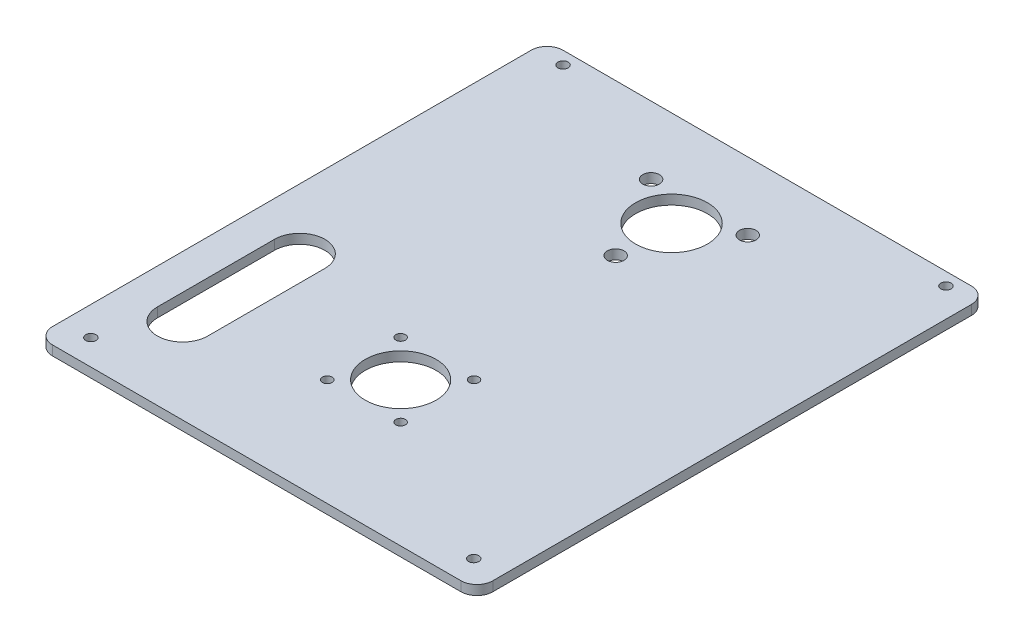
ISO-10303-21;
HEADER;
FILE_DESCRIPTION(('STEP AP214'),'2;1');
FILE_NAME('part.step','',(''),(''),'','','');
FILE_SCHEMA(('AUTOMOTIVE_DESIGN { 1 0 10303 214 1 1 1 1 }'));
ENDSEC;
DATA;
#1=APPLICATION_CONTEXT('core data for automotive mechanical design processes');
#2=APPLICATION_PROTOCOL_DEFINITION('international standard','automotive_design',2000,#1);
#3=PRODUCT_CONTEXT('',#1,'mechanical');
#4=PRODUCT('Part','Part','',(#3));
#5=PRODUCT_RELATED_PRODUCT_CATEGORY('part','',(#4));
#6=PRODUCT_DEFINITION_FORMATION('','',#4);
#7=PRODUCT_DEFINITION_CONTEXT('part definition',#1,'design');
#8=PRODUCT_DEFINITION('design','',#6,#7);
#9=PRODUCT_DEFINITION_SHAPE('','',#8);
#10=(LENGTH_UNIT() NAMED_UNIT(*) SI_UNIT(.MILLI.,.METRE.));
#11=(NAMED_UNIT(*) PLANE_ANGLE_UNIT() SI_UNIT($,.RADIAN.));
#12=(NAMED_UNIT(*) SI_UNIT($,.STERADIAN.) SOLID_ANGLE_UNIT());
#13=UNCERTAINTY_MEASURE_WITH_UNIT(LENGTH_MEASURE(1.E-05),#10,'distance_accuracy_value','');
#14=(GEOMETRIC_REPRESENTATION_CONTEXT(3) GLOBAL_UNCERTAINTY_ASSIGNED_CONTEXT((#13)) GLOBAL_UNIT_ASSIGNED_CONTEXT((#10,
#11,#12)) REPRESENTATION_CONTEXT('',''));
#15=CARTESIAN_POINT('',(0.,0.,0.));
#16=DIRECTION('',(0.,0.,1.));
#17=DIRECTION('',(1.,0.,0.));
#18=AXIS2_PLACEMENT_3D('',#15,#16,#17);
#19=CARTESIAN_POINT('',(64.,3.,75.));
#20=DIRECTION('',(0.,-1.,0.));
#21=DIRECTION('',(0.,0.,-1.));
#22=AXIS2_PLACEMENT_3D('',#19,#20,#21);
#23=PLANE('',#22);
#24=CARTESIAN_POINT('',(-15.15,3.,-58.75));
#25=DIRECTION('',(0.,1.,0.));
#26=DIRECTION('',(0.,0.,-1.));
#27=AXIS2_PLACEMENT_3D('',#24,#25,#26);
#28=CIRCLE('',#27,2.6);
#29=CARTESIAN_POINT('',(-15.15,3.,-61.35));
#30=VERTEX_POINT('',#29);
#31=EDGE_CURVE('E165',#30,#30,#28,.T.);
#32=ORIENTED_EDGE('',*,*,#31,.F.);
#33=EDGE_LOOP('',(#32));
#34=FACE_BOUND('',#33,.T.);
#35=CARTESIAN_POINT('',(15.15,3.,-58.75));
#36=DIRECTION('',(0.,1.,0.));
#37=DIRECTION('',(0.,0.,1.));
#38=AXIS2_PLACEMENT_3D('',#35,#36,#37);
#39=CIRCLE('',#38,2.6);
#40=CARTESIAN_POINT('',(15.15,3.,-56.15));
#41=VERTEX_POINT('',#40);
#42=EDGE_CURVE('E171',#41,#41,#39,.T.);
#43=ORIENTED_EDGE('',*,*,#42,.F.);
#44=EDGE_LOOP('',(#43));
#45=FACE_BOUND('',#44,.T.);
#46=CARTESIAN_POINT('',(0.,3.,-32.5));
#47=DIRECTION('',(0.,1.,0.));
#48=DIRECTION('',(0.,0.,1.));
#49=AXIS2_PLACEMENT_3D('',#46,#47,#48);
#50=CIRCLE('',#49,2.6);
#51=CARTESIAN_POINT('',(0.,3.,-29.9));
#52=VERTEX_POINT('',#51);
#53=EDGE_CURVE('E177',#52,#52,#50,.T.);
#54=ORIENTED_EDGE('',*,*,#53,.F.);
#55=EDGE_LOOP('',(#54));
#56=FACE_BOUND('',#55,.T.);
#57=CARTESIAN_POINT('',(-11.5,3.,23.4));
#58=DIRECTION('',(0.,1.,0.));
#59=DIRECTION('',(0.,0.,-1.));
#60=AXIS2_PLACEMENT_3D('',#57,#58,#59);
#61=CIRCLE('',#60,1.5);
#62=CARTESIAN_POINT('',(-11.5,3.,21.9));
#63=VERTEX_POINT('',#62);
#64=EDGE_CURVE('E183',#63,#63,#61,.T.);
#65=ORIENTED_EDGE('',*,*,#64,.F.);
#66=EDGE_LOOP('',(#65));
#67=FACE_BOUND('',#66,.T.);
#68=CARTESIAN_POINT('',(-11.5,3.,46.4));
#69=DIRECTION('',(0.,1.,0.));
#70=DIRECTION('',(0.,0.,-1.));
#71=AXIS2_PLACEMENT_3D('',#68,#69,#70);
#72=CIRCLE('',#71,1.5);
#73=CARTESIAN_POINT('',(-11.5,3.,44.9));
#74=VERTEX_POINT('',#73);
#75=EDGE_CURVE('E189',#74,#74,#72,.T.);
#76=ORIENTED_EDGE('',*,*,#75,.F.);
#77=EDGE_LOOP('',(#76));
#78=FACE_BOUND('',#77,.T.);
#79=CARTESIAN_POINT('',(11.5,3.,23.4));
#80=DIRECTION('',(0.,1.,0.));
#81=DIRECTION('',(0.,0.,1.));
#82=AXIS2_PLACEMENT_3D('',#79,#80,#81);
#83=CIRCLE('',#82,1.5);
#84=CARTESIAN_POINT('',(11.5,3.,24.9));
#85=VERTEX_POINT('',#84);
#86=EDGE_CURVE('E195',#85,#85,#83,.T.);
#87=ORIENTED_EDGE('',*,*,#86,.F.);
#88=EDGE_LOOP('',(#87));
#89=FACE_BOUND('',#88,.T.);
#90=CARTESIAN_POINT('',(11.5,3.,46.4));
#91=DIRECTION('',(0.,1.,0.));
#92=DIRECTION('',(0.,0.,1.));
#93=AXIS2_PLACEMENT_3D('',#90,#91,#92);
#94=CIRCLE('',#93,1.5);
#95=CARTESIAN_POINT('',(11.5,3.,47.9));
#96=VERTEX_POINT('',#95);
#97=EDGE_CURVE('E201',#96,#96,#94,.T.);
#98=ORIENTED_EDGE('',*,*,#97,.F.);
#99=EDGE_LOOP('',(#98));
#100=FACE_BOUND('',#99,.T.);
#101=CARTESIAN_POINT('',(0.,3.,-50.));
#102=DIRECTION('',(0.,1.,0.));
#103=DIRECTION('',(0.,0.,1.));
#104=AXIS2_PLACEMENT_3D('',#101,#102,#103);
#105=CIRCLE('',#104,11.25);
#106=CARTESIAN_POINT('',(0.,3.,-38.75));
#107=VERTEX_POINT('',#106);
#108=EDGE_CURVE('E207',#107,#107,#105,.T.);
#109=ORIENTED_EDGE('',*,*,#108,.F.);
#110=EDGE_LOOP('',(#109));
#111=FACE_BOUND('',#110,.T.);
#112=CARTESIAN_POINT('',(0.,3.,34.9));
#113=DIRECTION('',(0.,1.,0.));
#114=DIRECTION('',(0.,0.,1.));
#115=AXIS2_PLACEMENT_3D('',#112,#113,#114);
#116=CIRCLE('',#115,11.1);
#117=CARTESIAN_POINT('',(0.,3.,46.));
#118=VERTEX_POINT('',#117);
#119=EDGE_CURVE('E213',#118,#118,#116,.T.);
#120=ORIENTED_EDGE('',*,*,#119,.F.);
#121=EDGE_LOOP('',(#120));
#122=FACE_BOUND('',#121,.T.);
#123=CARTESIAN_POINT('',(-60.,3.,72.));
#124=DIRECTION('',(0.,1.,0.));
#125=DIRECTION('',(0.,0.,-1.));
#126=AXIS2_PLACEMENT_3D('',#123,#124,#125);
#127=CIRCLE('',#126,1.6);
#128=CARTESIAN_POINT('',(-60.,3.,70.4));
#129=VERTEX_POINT('',#128);
#130=EDGE_CURVE('E219',#129,#129,#127,.T.);
#131=ORIENTED_EDGE('',*,*,#130,.F.);
#132=EDGE_LOOP('',(#131));
#133=FACE_BOUND('',#132,.T.);
#134=CARTESIAN_POINT('',(60.,3.,72.));
#135=DIRECTION('',(0.,1.,0.));
#136=DIRECTION('',(0.,0.,1.));
#137=AXIS2_PLACEMENT_3D('',#134,#135,#136);
#138=CIRCLE('',#137,1.6);
#139=CARTESIAN_POINT('',(60.,3.,73.6));
#140=VERTEX_POINT('',#139);
#141=EDGE_CURVE('E225',#140,#140,#138,.T.);
#142=ORIENTED_EDGE('',*,*,#141,.F.);
#143=EDGE_LOOP('',(#142));
#144=FACE_BOUND('',#143,.T.);
#145=CARTESIAN_POINT('',(-60.,3.,-76.));
#146=DIRECTION('',(0.,1.,0.));
#147=DIRECTION('',(0.,0.,-1.));
#148=AXIS2_PLACEMENT_3D('',#145,#146,#147);
#149=CIRCLE('',#148,1.6);
#150=CARTESIAN_POINT('',(-60.,3.,-77.6));
#151=VERTEX_POINT('',#150);
#152=EDGE_CURVE('E231',#151,#151,#149,.T.);
#153=ORIENTED_EDGE('',*,*,#152,.F.);
#154=EDGE_LOOP('',(#153));
#155=FACE_BOUND('',#154,.T.);
#156=CARTESIAN_POINT('',(60.,3.,-76.));
#157=DIRECTION('',(0.,1.,0.));
#158=DIRECTION('',(0.,0.,1.));
#159=AXIS2_PLACEMENT_3D('',#156,#157,#158);
#160=CIRCLE('',#159,1.6);
#161=CARTESIAN_POINT('',(60.,3.,-74.4));
#162=VERTEX_POINT('',#161);
#163=EDGE_CURVE('E237',#162,#162,#160,.T.);
#164=ORIENTED_EDGE('',*,*,#163,.F.);
#165=EDGE_LOOP('',(#164));
#166=FACE_BOUND('',#165,.T.);
#167=CARTESIAN_POINT('',(64.,3.,75.));
#168=DIRECTION('',(0.,1.,0.));
#169=DIRECTION('',(0.,0.,-1.));
#170=AXIS2_PLACEMENT_3D('',#167,#168,#169);
#171=CIRCLE('',#170,5.);
#172=CARTESIAN_POINT('',(64.,3.,80.));
#173=VERTEX_POINT('',#172);
#174=CARTESIAN_POINT('',(69.,3.,75.));
#175=VERTEX_POINT('',#174);
#176=EDGE_CURVE('E243',#173,#175,#171,.T.);
#177=ORIENTED_EDGE('',*,*,#176,.T.);
#178=DIRECTION('',(0.,0.,-1.));
#179=VECTOR('',#178,1.);
#180=CARTESIAN_POINT('',(69.,3.,75.));
#181=LINE('',#180,#179);
#182=CARTESIAN_POINT('',(69.,3.,-75.));
#183=VERTEX_POINT('',#182);
#184=EDGE_CURVE('E246',#175,#183,#181,.T.);
#185=ORIENTED_EDGE('',*,*,#184,.T.);
#186=CARTESIAN_POINT('',(64.,3.,-75.));
#187=DIRECTION('',(0.,1.,0.));
#188=DIRECTION('',(0.,0.,1.));
#189=AXIS2_PLACEMENT_3D('',#186,#187,#188);
#190=CIRCLE('',#189,5.);
#191=CARTESIAN_POINT('',(64.,3.,-80.));
#192=VERTEX_POINT('',#191);
#193=EDGE_CURVE('E249',#183,#192,#190,.T.);
#194=ORIENTED_EDGE('',*,*,#193,.T.);
#195=DIRECTION('',(-1.,0.,0.));
#196=VECTOR('',#195,1.);
#197=CARTESIAN_POINT('',(64.,3.,-80.));
#198=LINE('',#197,#196);
#199=CARTESIAN_POINT('',(-64.,3.,-80.));
#200=VERTEX_POINT('',#199);
#201=EDGE_CURVE('E251',#192,#200,#198,.T.);
#202=ORIENTED_EDGE('',*,*,#201,.T.);
#203=CARTESIAN_POINT('',(-64.,3.,-75.));
#204=DIRECTION('',(0.,1.,0.));
#205=DIRECTION('',(0.,0.,-1.));
#206=AXIS2_PLACEMENT_3D('',#203,#204,#205);
#207=CIRCLE('',#206,5.);
#208=CARTESIAN_POINT('',(-69.,3.,-75.));
#209=VERTEX_POINT('',#208);
#210=EDGE_CURVE('E253',#200,#209,#207,.T.);
#211=ORIENTED_EDGE('',*,*,#210,.T.);
#212=DIRECTION('',(0.,0.,1.));
#213=VECTOR('',#212,1.);
#214=CARTESIAN_POINT('',(-69.,3.,75.));
#215=LINE('',#214,#213);
#216=CARTESIAN_POINT('',(-69.,3.,75.));
#217=VERTEX_POINT('',#216);
#218=EDGE_CURVE('E255',#209,#217,#215,.T.);
#219=ORIENTED_EDGE('',*,*,#218,.T.);
#220=CARTESIAN_POINT('',(-64.,3.,75.));
#221=DIRECTION('',(0.,1.,0.));
#222=DIRECTION('',(0.,0.,-1.));
#223=AXIS2_PLACEMENT_3D('',#220,#221,#222);
#224=CIRCLE('',#223,5.);
#225=CARTESIAN_POINT('',(-64.,3.,80.));
#226=VERTEX_POINT('',#225);
#227=EDGE_CURVE('E257',#217,#226,#224,.T.);
#228=ORIENTED_EDGE('',*,*,#227,.T.);
#229=DIRECTION('',(1.,0.,0.));
#230=VECTOR('',#229,1.);
#231=CARTESIAN_POINT('',(64.,3.,80.));
#232=LINE('',#231,#230);
#233=EDGE_CURVE('E259',#226,#173,#232,.T.);
#234=ORIENTED_EDGE('',*,*,#233,.T.);
#235=EDGE_LOOP('',(#177,#185,#194,#202,#211,#219,#228,#234));
#236=FACE_BOUND('',#235,.T.);
#237=CARTESIAN_POINT('',(-50.,3.,16.55));
#238=DIRECTION('',(0.,1.,0.));
#239=DIRECTION('',(0.,0.,1.));
#240=AXIS2_PLACEMENT_3D('',#237,#238,#239);
#241=CIRCLE('',#240,7.89999999999998);
#242=CARTESIAN_POINT('',(-42.1,3.,16.55));
#243=VERTEX_POINT('',#242);
#244=CARTESIAN_POINT('',(-57.9,3.,16.55));
#245=VERTEX_POINT('',#244);
#246=EDGE_CURVE('E129',#243,#245,#241,.T.);
#247=ORIENTED_EDGE('',*,*,#246,.F.);
#248=DIRECTION('',(0.,0.,-1.));
#249=VECTOR('',#248,1.);
#250=CARTESIAN_POINT('',(-42.1,3.,16.55));
#251=LINE('',#250,#249);
#252=CARTESIAN_POINT('',(-42.1,3.,53.25));
#253=VERTEX_POINT('',#252);
#254=EDGE_CURVE('E151',#253,#243,#251,.T.);
#255=ORIENTED_EDGE('',*,*,#254,.F.);
#256=CARTESIAN_POINT('',(-50.,3.,53.25));
#257=DIRECTION('',(0.,1.,0.));
#258=DIRECTION('',(0.,0.,1.));
#259=AXIS2_PLACEMENT_3D('',#256,#257,#258);
#260=CIRCLE('',#259,7.89999999999998);
#261=CARTESIAN_POINT('',(-57.9,3.,53.25));
#262=VERTEX_POINT('',#261);
#263=EDGE_CURVE('E149',#262,#253,#260,.T.);
#264=ORIENTED_EDGE('',*,*,#263,.F.);
#265=DIRECTION('',(0.,0.,1.));
#266=VECTOR('',#265,1.);
#267=CARTESIAN_POINT('',(-57.9,3.,16.55));
#268=LINE('',#267,#266);
#269=EDGE_CURVE('E137',#245,#262,#268,.T.);
#270=ORIENTED_EDGE('',*,*,#269,.F.);
#271=EDGE_LOOP('',(#247,#255,#264,#270));
#272=FACE_BOUND('',#271,.T.);
#273=ADVANCED_FACE('F40',(#34,#45,#56,#67,#78,#89,#100,#111,#122,#133,#144,#155,#166,#236,#272),
#23,.F.);
#274=CARTESIAN_POINT('',(64.,0.,75.));
#275=DIRECTION('',(0.,-1.,0.));
#276=DIRECTION('',(0.,0.,-1.));
#277=AXIS2_PLACEMENT_3D('',#274,#275,#276);
#278=PLANE('',#277);
#279=CARTESIAN_POINT('',(15.15,0.,-58.75));
#280=DIRECTION('',(0.,1.,0.));
#281=DIRECTION('',(0.,0.,1.));
#282=AXIS2_PLACEMENT_3D('',#279,#280,#281);
#283=CIRCLE('',#282,2.6);
#284=CARTESIAN_POINT('',(15.15,0.,-56.15));
#285=VERTEX_POINT('',#284);
#286=EDGE_CURVE('E168',#285,#285,#283,.T.);
#287=ORIENTED_EDGE('',*,*,#286,.T.);
#288=EDGE_LOOP('',(#287));
#289=FACE_BOUND('',#288,.T.);
#290=CARTESIAN_POINT('',(-11.5,0.,23.4));
#291=DIRECTION('',(0.,1.,0.));
#292=DIRECTION('',(0.,0.,-1.));
#293=AXIS2_PLACEMENT_3D('',#290,#291,#292);
#294=CIRCLE('',#293,1.5);
#295=CARTESIAN_POINT('',(-11.5,0.,21.9));
#296=VERTEX_POINT('',#295);
#297=EDGE_CURVE('E180',#296,#296,#294,.T.);
#298=ORIENTED_EDGE('',*,*,#297,.T.);
#299=EDGE_LOOP('',(#298));
#300=FACE_BOUND('',#299,.T.);
#301=CARTESIAN_POINT('',(11.5,0.,23.4));
#302=DIRECTION('',(0.,1.,0.));
#303=DIRECTION('',(0.,0.,1.));
#304=AXIS2_PLACEMENT_3D('',#301,#302,#303);
#305=CIRCLE('',#304,1.5);
#306=CARTESIAN_POINT('',(11.5,0.,24.9));
#307=VERTEX_POINT('',#306);
#308=EDGE_CURVE('E192',#307,#307,#305,.T.);
#309=ORIENTED_EDGE('',*,*,#308,.T.);
#310=EDGE_LOOP('',(#309));
#311=FACE_BOUND('',#310,.T.);
#312=CARTESIAN_POINT('',(0.,0.,-50.));
#313=DIRECTION('',(0.,1.,0.));
#314=DIRECTION('',(0.,0.,1.));
#315=AXIS2_PLACEMENT_3D('',#312,#313,#314);
#316=CIRCLE('',#315,11.25);
#317=CARTESIAN_POINT('',(0.,0.,-38.75));
#318=VERTEX_POINT('',#317);
#319=EDGE_CURVE('E204',#318,#318,#316,.T.);
#320=ORIENTED_EDGE('',*,*,#319,.T.);
#321=EDGE_LOOP('',(#320));
#322=FACE_BOUND('',#321,.T.);
#323=CARTESIAN_POINT('',(-60.,0.,72.));
#324=DIRECTION('',(0.,1.,0.));
#325=DIRECTION('',(0.,0.,-1.));
#326=AXIS2_PLACEMENT_3D('',#323,#324,#325);
#327=CIRCLE('',#326,1.6);
#328=CARTESIAN_POINT('',(-60.,0.,70.4));
#329=VERTEX_POINT('',#328);
#330=EDGE_CURVE('E216',#329,#329,#327,.T.);
#331=ORIENTED_EDGE('',*,*,#330,.T.);
#332=EDGE_LOOP('',(#331));
#333=FACE_BOUND('',#332,.T.);
#334=CARTESIAN_POINT('',(-60.,0.,-76.));
#335=DIRECTION('',(0.,1.,0.));
#336=DIRECTION('',(0.,0.,-1.));
#337=AXIS2_PLACEMENT_3D('',#334,#335,#336);
#338=CIRCLE('',#337,1.6);
#339=CARTESIAN_POINT('',(-60.,0.,-77.6));
#340=VERTEX_POINT('',#339);
#341=EDGE_CURVE('E228',#340,#340,#338,.T.);
#342=ORIENTED_EDGE('',*,*,#341,.T.);
#343=EDGE_LOOP('',(#342));
#344=FACE_BOUND('',#343,.T.);
#345=CARTESIAN_POINT('',(64.,0.,75.));
#346=DIRECTION('',(0.,1.,0.));
#347=DIRECTION('',(0.,0.,-1.));
#348=AXIS2_PLACEMENT_3D('',#345,#346,#347);
#349=CIRCLE('',#348,5.);
#350=CARTESIAN_POINT('',(64.,0.,80.));
#351=VERTEX_POINT('',#350);
#352=CARTESIAN_POINT('',(69.,0.,75.));
#353=VERTEX_POINT('',#352);
#354=EDGE_CURVE('E240',#351,#353,#349,.T.);
#355=ORIENTED_EDGE('',*,*,#354,.F.);
#356=DIRECTION('',(1.,0.,0.));
#357=VECTOR('',#356,1.);
#358=CARTESIAN_POINT('',(64.,0.,80.));
#359=LINE('',#358,#357);
#360=CARTESIAN_POINT('',(-64.,0.,80.));
#361=VERTEX_POINT('',#360);
#362=EDGE_CURVE('E247',#361,#351,#359,.T.);
#363=ORIENTED_EDGE('',*,*,#362,.F.);
#364=CARTESIAN_POINT('',(-64.,0.,75.));
#365=DIRECTION('',(0.,1.,0.));
#366=DIRECTION('',(0.,0.,-1.));
#367=AXIS2_PLACEMENT_3D('',#364,#365,#366);
#368=CIRCLE('',#367,5.);
#369=CARTESIAN_POINT('',(-69.,0.,75.));
#370=VERTEX_POINT('',#369);
#371=EDGE_CURVE('E274',#370,#361,#368,.T.);
#372=ORIENTED_EDGE('',*,*,#371,.F.);
#373=DIRECTION('',(0.,0.,1.));
#374=VECTOR('',#373,1.);
#375=CARTESIAN_POINT('',(-69.,0.,75.));
#376=LINE('',#375,#374);
#377=CARTESIAN_POINT('',(-69.,0.,-75.));
#378=VERTEX_POINT('',#377);
#379=EDGE_CURVE('E272',#378,#370,#376,.T.);
#380=ORIENTED_EDGE('',*,*,#379,.F.);
#381=CARTESIAN_POINT('',(-64.,0.,-75.));
#382=DIRECTION('',(0.,1.,0.));
#383=DIRECTION('',(0.,0.,-1.));
#384=AXIS2_PLACEMENT_3D('',#381,#382,#383);
#385=CIRCLE('',#384,5.);
#386=CARTESIAN_POINT('',(-64.,0.,-80.));
#387=VERTEX_POINT('',#386);
#388=EDGE_CURVE('E270',#387,#378,#385,.T.);
#389=ORIENTED_EDGE('',*,*,#388,.F.);
#390=DIRECTION('',(-1.,0.,0.));
#391=VECTOR('',#390,1.);
#392=CARTESIAN_POINT('',(64.,0.,-80.));
#393=LINE('',#392,#391);
#394=CARTESIAN_POINT('',(64.,0.,-80.));
#395=VERTEX_POINT('',#394);
#396=EDGE_CURVE('E268',#395,#387,#393,.T.);
#397=ORIENTED_EDGE('',*,*,#396,.F.);
#398=CARTESIAN_POINT('',(64.,0.,-75.));
#399=DIRECTION('',(0.,1.,0.));
#400=DIRECTION('',(0.,0.,1.));
#401=AXIS2_PLACEMENT_3D('',#398,#399,#400);
#402=CIRCLE('',#401,5.);
#403=CARTESIAN_POINT('',(69.,0.,-75.));
#404=VERTEX_POINT('',#403);
#405=EDGE_CURVE('E266',#404,#395,#402,.T.);
#406=ORIENTED_EDGE('',*,*,#405,.F.);
#407=DIRECTION('',(0.,0.,-1.));
#408=VECTOR('',#407,1.);
#409=CARTESIAN_POINT('',(69.,0.,75.));
#410=LINE('',#409,#408);
#411=EDGE_CURVE('E264',#353,#404,#410,.T.);
#412=ORIENTED_EDGE('',*,*,#411,.F.);
#413=EDGE_LOOP('',(#355,#363,#372,#380,#389,#397,#406,#412));
#414=FACE_BOUND('',#413,.T.);
#415=CARTESIAN_POINT('',(60.,0.,-76.));
#416=DIRECTION('',(0.,1.,0.));
#417=DIRECTION('',(0.,0.,1.));
#418=AXIS2_PLACEMENT_3D('',#415,#416,#417);
#419=CIRCLE('',#418,1.6);
#420=CARTESIAN_POINT('',(60.,0.,-74.4));
#421=VERTEX_POINT('',#420);
#422=EDGE_CURVE('E234',#421,#421,#419,.T.);
#423=ORIENTED_EDGE('',*,*,#422,.T.);
#424=EDGE_LOOP('',(#423));
#425=FACE_BOUND('',#424,.T.);
#426=CARTESIAN_POINT('',(60.,0.,72.));
#427=DIRECTION('',(0.,1.,0.));
#428=DIRECTION('',(0.,0.,1.));
#429=AXIS2_PLACEMENT_3D('',#426,#427,#428);
#430=CIRCLE('',#429,1.6);
#431=CARTESIAN_POINT('',(60.,0.,73.6));
#432=VERTEX_POINT('',#431);
#433=EDGE_CURVE('E222',#432,#432,#430,.T.);
#434=ORIENTED_EDGE('',*,*,#433,.T.);
#435=EDGE_LOOP('',(#434));
#436=FACE_BOUND('',#435,.T.);
#437=CARTESIAN_POINT('',(0.,0.,34.9));
#438=DIRECTION('',(0.,1.,0.));
#439=DIRECTION('',(0.,0.,1.));
#440=AXIS2_PLACEMENT_3D('',#437,#438,#439);
#441=CIRCLE('',#440,11.1);
#442=CARTESIAN_POINT('',(0.,0.,46.));
#443=VERTEX_POINT('',#442);
#444=EDGE_CURVE('E210',#443,#443,#441,.T.);
#445=ORIENTED_EDGE('',*,*,#444,.T.);
#446=EDGE_LOOP('',(#445));
#447=FACE_BOUND('',#446,.T.);
#448=CARTESIAN_POINT('',(11.5,0.,46.4));
#449=DIRECTION('',(0.,1.,0.));
#450=DIRECTION('',(0.,0.,1.));
#451=AXIS2_PLACEMENT_3D('',#448,#449,#450);
#452=CIRCLE('',#451,1.5);
#453=CARTESIAN_POINT('',(11.5,0.,47.9));
#454=VERTEX_POINT('',#453);
#455=EDGE_CURVE('E198',#454,#454,#452,.T.);
#456=ORIENTED_EDGE('',*,*,#455,.T.);
#457=EDGE_LOOP('',(#456));
#458=FACE_BOUND('',#457,.T.);
#459=CARTESIAN_POINT('',(-11.5,0.,46.4));
#460=DIRECTION('',(0.,1.,0.));
#461=DIRECTION('',(0.,0.,-1.));
#462=AXIS2_PLACEMENT_3D('',#459,#460,#461);
#463=CIRCLE('',#462,1.5);
#464=CARTESIAN_POINT('',(-11.5,0.,44.9));
#465=VERTEX_POINT('',#464);
#466=EDGE_CURVE('E186',#465,#465,#463,.T.);
#467=ORIENTED_EDGE('',*,*,#466,.T.);
#468=EDGE_LOOP('',(#467));
#469=FACE_BOUND('',#468,.T.);
#470=CARTESIAN_POINT('',(0.,0.,-32.5));
#471=DIRECTION('',(0.,1.,0.));
#472=DIRECTION('',(0.,0.,1.));
#473=AXIS2_PLACEMENT_3D('',#470,#471,#472);
#474=CIRCLE('',#473,2.6);
#475=CARTESIAN_POINT('',(0.,0.,-29.9));
#476=VERTEX_POINT('',#475);
#477=EDGE_CURVE('E174',#476,#476,#474,.T.);
#478=ORIENTED_EDGE('',*,*,#477,.T.);
#479=EDGE_LOOP('',(#478));
#480=FACE_BOUND('',#479,.T.);
#481=CARTESIAN_POINT('',(-15.15,0.,-58.75));
#482=DIRECTION('',(0.,1.,0.));
#483=DIRECTION('',(0.,0.,-1.));
#484=AXIS2_PLACEMENT_3D('',#481,#482,#483);
#485=CIRCLE('',#484,2.6);
#486=CARTESIAN_POINT('',(-15.15,0.,-61.35));
#487=VERTEX_POINT('',#486);
#488=EDGE_CURVE('E145',#487,#487,#485,.T.);
#489=ORIENTED_EDGE('',*,*,#488,.T.);
#490=EDGE_LOOP('',(#489));
#491=FACE_BOUND('',#490,.T.);
#492=DIRECTION('',(0.,0.,-1.));
#493=VECTOR('',#492,1.);
#494=CARTESIAN_POINT('',(-42.1,0.,16.55));
#495=LINE('',#494,#493);
#496=CARTESIAN_POINT('',(-42.1,0.,53.25));
#497=VERTEX_POINT('',#496);
#498=CARTESIAN_POINT('',(-42.1,0.,16.55));
#499=VERTEX_POINT('',#498);
#500=EDGE_CURVE('E138',#497,#499,#495,.T.);
#501=ORIENTED_EDGE('',*,*,#500,.T.);
#502=CARTESIAN_POINT('',(-50.,0.,16.55));
#503=DIRECTION('',(0.,1.,0.));
#504=DIRECTION('',(0.,0.,1.));
#505=AXIS2_PLACEMENT_3D('',#502,#503,#504);
#506=CIRCLE('',#505,7.89999999999998);
#507=CARTESIAN_POINT('',(-57.9,0.,16.55));
#508=VERTEX_POINT('',#507);
#509=EDGE_CURVE('E63',#499,#508,#506,.T.);
#510=ORIENTED_EDGE('',*,*,#509,.T.);
#511=DIRECTION('',(0.,0.,1.));
#512=VECTOR('',#511,1.);
#513=CARTESIAN_POINT('',(-57.9,0.,16.55));
#514=LINE('',#513,#512);
#515=CARTESIAN_POINT('',(-57.9,0.,53.25));
#516=VERTEX_POINT('',#515);
#517=EDGE_CURVE('E144',#508,#516,#514,.T.);
#518=ORIENTED_EDGE('',*,*,#517,.T.);
#519=CARTESIAN_POINT('',(-50.,0.,53.25));
#520=DIRECTION('',(0.,1.,0.));
#521=DIRECTION('',(0.,0.,1.));
#522=AXIS2_PLACEMENT_3D('',#519,#520,#521);
#523=CIRCLE('',#522,7.89999999999998);
#524=EDGE_CURVE('E157',#516,#497,#523,.T.);
#525=ORIENTED_EDGE('',*,*,#524,.T.);
#526=EDGE_LOOP('',(#501,#510,#518,#525));
#527=FACE_BOUND('',#526,.T.);
#528=ADVANCED_FACE('F304',(#289,#300,#311,#322,#333,#344,#414,#425,#436,#447,#458,#469,#480,
#491,#527),#278,.T.);
#529=CARTESIAN_POINT('',(64.,3.,75.));
#530=DIRECTION('',(0.,-1.,0.));
#531=DIRECTION('',(0.,0.,-1.));
#532=AXIS2_PLACEMENT_3D('',#529,#530,#531);
#533=CYLINDRICAL_SURFACE('',#532,5.);
#534=ORIENTED_EDGE('',*,*,#354,.T.);
#535=DIRECTION('',(0.,-1.,0.));
#536=VECTOR('',#535,1.);
#537=CARTESIAN_POINT('',(69.,3.,75.));
#538=LINE('',#537,#536);
#539=EDGE_CURVE('E11',#175,#353,#538,.T.);
#540=ORIENTED_EDGE('',*,*,#539,.F.);
#541=ORIENTED_EDGE('',*,*,#176,.F.);
#542=DIRECTION('',(0.,-1.,0.));
#543=VECTOR('',#542,1.);
#544=CARTESIAN_POINT('',(64.,3.,80.));
#545=LINE('',#544,#543);
#546=EDGE_CURVE('E261',#173,#351,#545,.T.);
#547=ORIENTED_EDGE('',*,*,#546,.T.);
#548=EDGE_LOOP('',(#534,#540,#541,#547));
#549=FACE_BOUND('',#548,.T.);
#550=ADVANCED_FACE('F42',(#549),#533,.T.);
#551=CARTESIAN_POINT('',(69.,3.,75.));
#552=DIRECTION('',(-1.,0.,0.));
#553=DIRECTION('',(0.,0.,1.));
#554=AXIS2_PLACEMENT_3D('',#551,#552,#553);
#555=PLANE('',#554);
#556=ORIENTED_EDGE('',*,*,#411,.T.);
#557=DIRECTION('',(0.,-1.,0.));
#558=VECTOR('',#557,1.);
#559=CARTESIAN_POINT('',(69.,3.,-75.));
#560=LINE('',#559,#558);
#561=EDGE_CURVE('E48',#183,#404,#560,.T.);
#562=ORIENTED_EDGE('',*,*,#561,.F.);
#563=ORIENTED_EDGE('',*,*,#184,.F.);
#564=ORIENTED_EDGE('',*,*,#539,.T.);
#565=EDGE_LOOP('',(#556,#562,#563,#564));
#566=FACE_BOUND('',#565,.T.);
#567=ADVANCED_FACE('F321',(#566),#555,.F.);
#568=CARTESIAN_POINT('',(64.,3.,-75.));
#569=DIRECTION('',(0.,-1.,0.));
#570=DIRECTION('',(0.,0.,-1.));
#571=AXIS2_PLACEMENT_3D('',#568,#569,#570);
#572=CYLINDRICAL_SURFACE('',#571,5.);
#573=ORIENTED_EDGE('',*,*,#405,.T.);
#574=DIRECTION('',(0.,-1.,0.));
#575=VECTOR('',#574,1.);
#576=CARTESIAN_POINT('',(64.,3.,-80.));
#577=LINE('',#576,#575);
#578=EDGE_CURVE('E291',#192,#395,#577,.T.);
#579=ORIENTED_EDGE('',*,*,#578,.F.);
#580=ORIENTED_EDGE('',*,*,#193,.F.);
#581=ORIENTED_EDGE('',*,*,#561,.T.);
#582=EDGE_LOOP('',(#573,#579,#580,#581));
#583=FACE_BOUND('',#582,.T.);
#584=ADVANCED_FACE('F298',(#583),#572,.T.);
#585=CARTESIAN_POINT('',(64.,3.,-80.));
#586=DIRECTION('',(0.,0.,1.));
#587=DIRECTION('',(1.,0.,0.));
#588=AXIS2_PLACEMENT_3D('',#585,#586,#587);
#589=PLANE('',#588);
#590=ORIENTED_EDGE('',*,*,#396,.T.);
#591=DIRECTION('',(0.,-1.,0.));
#592=VECTOR('',#591,1.);
#593=CARTESIAN_POINT('',(-64.,3.,-80.));
#594=LINE('',#593,#592);
#595=EDGE_CURVE('E288',#200,#387,#594,.T.);
#596=ORIENTED_EDGE('',*,*,#595,.F.);
#597=ORIENTED_EDGE('',*,*,#201,.F.);
#598=ORIENTED_EDGE('',*,*,#578,.T.);
#599=EDGE_LOOP('',(#590,#596,#597,#598));
#600=FACE_BOUND('',#599,.T.);
#601=ADVANCED_FACE('F310',(#600),#589,.F.);
#602=CARTESIAN_POINT('',(-64.,3.,-75.));
#603=DIRECTION('',(0.,-1.,0.));
#604=DIRECTION('',(0.,0.,-1.));
#605=AXIS2_PLACEMENT_3D('',#602,#603,#604);
#606=CYLINDRICAL_SURFACE('',#605,5.);
#607=ORIENTED_EDGE('',*,*,#388,.T.);
#608=DIRECTION('',(0.,-1.,0.));
#609=VECTOR('',#608,1.);
#610=CARTESIAN_POINT('',(-69.,3.,-75.));
#611=LINE('',#610,#609);
#612=EDGE_CURVE('E285',#209,#378,#611,.T.);
#613=ORIENTED_EDGE('',*,*,#612,.F.);
#614=ORIENTED_EDGE('',*,*,#210,.F.);
#615=ORIENTED_EDGE('',*,*,#595,.T.);
#616=EDGE_LOOP('',(#607,#613,#614,#615));
#617=FACE_BOUND('',#616,.T.);
#618=ADVANCED_FACE('F314',(#617),#606,.T.);
#619=CARTESIAN_POINT('',(-69.,3.,75.));
#620=DIRECTION('',(1.,0.,0.));
#621=DIRECTION('',(0.,0.,-1.));
#622=AXIS2_PLACEMENT_3D('',#619,#620,#621);
#623=PLANE('',#622);
#624=ORIENTED_EDGE('',*,*,#379,.T.);
#625=DIRECTION('',(0.,-1.,0.));
#626=VECTOR('',#625,1.);
#627=CARTESIAN_POINT('',(-69.,3.,75.));
#628=LINE('',#627,#626);
#629=EDGE_CURVE('E282',#217,#370,#628,.T.);
#630=ORIENTED_EDGE('',*,*,#629,.F.);
#631=ORIENTED_EDGE('',*,*,#218,.F.);
#632=ORIENTED_EDGE('',*,*,#612,.T.);
#633=EDGE_LOOP('',(#624,#630,#631,#632));
#634=FACE_BOUND('',#633,.T.);
#635=ADVANCED_FACE('F334',(#634),#623,.F.);
#636=CARTESIAN_POINT('',(-64.,3.,75.));
#637=DIRECTION('',(0.,-1.,0.));
#638=DIRECTION('',(0.,0.,-1.));
#639=AXIS2_PLACEMENT_3D('',#636,#637,#638);
#640=CYLINDRICAL_SURFACE('',#639,5.);
#641=ORIENTED_EDGE('',*,*,#371,.T.);
#642=DIRECTION('',(0.,-1.,0.));
#643=VECTOR('',#642,1.);
#644=CARTESIAN_POINT('',(-64.,3.,80.));
#645=LINE('',#644,#643);
#646=EDGE_CURVE('E279',#226,#361,#645,.T.);
#647=ORIENTED_EDGE('',*,*,#646,.F.);
#648=ORIENTED_EDGE('',*,*,#227,.F.);
#649=ORIENTED_EDGE('',*,*,#629,.T.);
#650=EDGE_LOOP('',(#641,#647,#648,#649));
#651=FACE_BOUND('',#650,.T.);
#652=ADVANCED_FACE('F332',(#651),#640,.T.);
#653=CARTESIAN_POINT('',(64.,3.,80.));
#654=DIRECTION('',(0.,0.,-1.));
#655=DIRECTION('',(-1.,0.,0.));
#656=AXIS2_PLACEMENT_3D('',#653,#654,#655);
#657=PLANE('',#656);
#658=ORIENTED_EDGE('',*,*,#362,.T.);
#659=ORIENTED_EDGE('',*,*,#546,.F.);
#660=ORIENTED_EDGE('',*,*,#233,.F.);
#661=ORIENTED_EDGE('',*,*,#646,.T.);
#662=EDGE_LOOP('',(#658,#659,#660,#661));
#663=FACE_BOUND('',#662,.T.);
#664=ADVANCED_FACE('F327',(#663),#657,.F.);
#665=CARTESIAN_POINT('',(60.,3.,-76.));
#666=DIRECTION('',(0.,-1.,0.));
#667=DIRECTION('',(0.,0.,-1.));
#668=AXIS2_PLACEMENT_3D('',#665,#666,#667);
#669=CYLINDRICAL_SURFACE('',#668,1.6);
#670=ORIENTED_EDGE('',*,*,#163,.T.);
#671=EDGE_LOOP('',(#670));
#672=FACE_BOUND('',#671,.T.);
#673=ORIENTED_EDGE('',*,*,#422,.F.);
#674=EDGE_LOOP('',(#673));
#675=FACE_BOUND('',#674,.T.);
#676=ADVANCED_FACE('F354',(#672,#675),#669,.F.);
#677=CARTESIAN_POINT('',(-60.,3.,-76.));
#678=DIRECTION('',(0.,-1.,0.));
#679=DIRECTION('',(0.,0.,-1.));
#680=AXIS2_PLACEMENT_3D('',#677,#678,#679);
#681=CYLINDRICAL_SURFACE('',#680,1.6);
#682=ORIENTED_EDGE('',*,*,#152,.T.);
#683=EDGE_LOOP('',(#682));
#684=FACE_BOUND('',#683,.T.);
#685=ORIENTED_EDGE('',*,*,#341,.F.);
#686=EDGE_LOOP('',(#685));
#687=FACE_BOUND('',#686,.T.);
#688=ADVANCED_FACE('F361',(#684,#687),#681,.F.);
#689=CARTESIAN_POINT('',(60.,3.,72.));
#690=DIRECTION('',(0.,-1.,0.));
#691=DIRECTION('',(0.,0.,-1.));
#692=AXIS2_PLACEMENT_3D('',#689,#690,#691);
#693=CYLINDRICAL_SURFACE('',#692,1.6);
#694=ORIENTED_EDGE('',*,*,#141,.T.);
#695=EDGE_LOOP('',(#694));
#696=FACE_BOUND('',#695,.T.);
#697=ORIENTED_EDGE('',*,*,#433,.F.);
#698=EDGE_LOOP('',(#697));
#699=FACE_BOUND('',#698,.T.);
#700=ADVANCED_FACE('F366',(#696,#699),#693,.F.);
#701=CARTESIAN_POINT('',(-60.,3.,72.));
#702=DIRECTION('',(0.,-1.,0.));
#703=DIRECTION('',(0.,0.,-1.));
#704=AXIS2_PLACEMENT_3D('',#701,#702,#703);
#705=CYLINDRICAL_SURFACE('',#704,1.6);
#706=ORIENTED_EDGE('',*,*,#130,.T.);
#707=EDGE_LOOP('',(#706));
#708=FACE_BOUND('',#707,.T.);
#709=ORIENTED_EDGE('',*,*,#330,.F.);
#710=EDGE_LOOP('',(#709));
#711=FACE_BOUND('',#710,.T.);
#712=ADVANCED_FACE('F434',(#708,#711),#705,.F.);
#713=CARTESIAN_POINT('',(0.,3.,34.9));
#714=DIRECTION('',(0.,-1.,0.));
#715=DIRECTION('',(0.,0.,-1.));
#716=AXIS2_PLACEMENT_3D('',#713,#714,#715);
#717=CYLINDRICAL_SURFACE('',#716,11.1);
#718=ORIENTED_EDGE('',*,*,#119,.T.);
#719=EDGE_LOOP('',(#718));
#720=FACE_BOUND('',#719,.T.);
#721=ORIENTED_EDGE('',*,*,#444,.F.);
#722=EDGE_LOOP('',(#721));
#723=FACE_BOUND('',#722,.T.);
#724=ADVANCED_FACE('F430',(#720,#723),#717,.F.);
#725=CARTESIAN_POINT('',(0.,3.,-50.));
#726=DIRECTION('',(0.,-1.,0.));
#727=DIRECTION('',(0.,0.,-1.));
#728=AXIS2_PLACEMENT_3D('',#725,#726,#727);
#729=CYLINDRICAL_SURFACE('',#728,11.25);
#730=ORIENTED_EDGE('',*,*,#108,.T.);
#731=EDGE_LOOP('',(#730));
#732=FACE_BOUND('',#731,.T.);
#733=ORIENTED_EDGE('',*,*,#319,.F.);
#734=EDGE_LOOP('',(#733));
#735=FACE_BOUND('',#734,.T.);
#736=ADVANCED_FACE('F426',(#732,#735),#729,.F.);
#737=CARTESIAN_POINT('',(11.5,3.,46.4));
#738=DIRECTION('',(0.,-1.,0.));
#739=DIRECTION('',(0.,0.,-1.));
#740=AXIS2_PLACEMENT_3D('',#737,#738,#739);
#741=CYLINDRICAL_SURFACE('',#740,1.5);
#742=ORIENTED_EDGE('',*,*,#97,.T.);
#743=EDGE_LOOP('',(#742));
#744=FACE_BOUND('',#743,.T.);
#745=ORIENTED_EDGE('',*,*,#455,.F.);
#746=EDGE_LOOP('',(#745));
#747=FACE_BOUND('',#746,.T.);
#748=ADVANCED_FACE('F422',(#744,#747),#741,.F.);
#749=CARTESIAN_POINT('',(11.5,3.,23.4));
#750=DIRECTION('',(0.,-1.,0.));
#751=DIRECTION('',(0.,0.,-1.));
#752=AXIS2_PLACEMENT_3D('',#749,#750,#751);
#753=CYLINDRICAL_SURFACE('',#752,1.5);
#754=ORIENTED_EDGE('',*,*,#86,.T.);
#755=EDGE_LOOP('',(#754));
#756=FACE_BOUND('',#755,.T.);
#757=ORIENTED_EDGE('',*,*,#308,.F.);
#758=EDGE_LOOP('',(#757));
#759=FACE_BOUND('',#758,.T.);
#760=ADVANCED_FACE('F418',(#756,#759),#753,.F.);
#761=CARTESIAN_POINT('',(-11.5,3.,46.4));
#762=DIRECTION('',(0.,-1.,0.));
#763=DIRECTION('',(0.,0.,-1.));
#764=AXIS2_PLACEMENT_3D('',#761,#762,#763);
#765=CYLINDRICAL_SURFACE('',#764,1.5);
#766=ORIENTED_EDGE('',*,*,#75,.T.);
#767=EDGE_LOOP('',(#766));
#768=FACE_BOUND('',#767,.T.);
#769=ORIENTED_EDGE('',*,*,#466,.F.);
#770=EDGE_LOOP('',(#769));
#771=FACE_BOUND('',#770,.T.);
#772=ADVANCED_FACE('F414',(#768,#771),#765,.F.);
#773=CARTESIAN_POINT('',(-11.5,3.,23.4));
#774=DIRECTION('',(0.,-1.,0.));
#775=DIRECTION('',(0.,0.,-1.));
#776=AXIS2_PLACEMENT_3D('',#773,#774,#775);
#777=CYLINDRICAL_SURFACE('',#776,1.5);
#778=ORIENTED_EDGE('',*,*,#64,.T.);
#779=EDGE_LOOP('',(#778));
#780=FACE_BOUND('',#779,.T.);
#781=ORIENTED_EDGE('',*,*,#297,.F.);
#782=EDGE_LOOP('',(#781));
#783=FACE_BOUND('',#782,.T.);
#784=ADVANCED_FACE('F410',(#780,#783),#777,.F.);
#785=CARTESIAN_POINT('',(0.,3.,-32.5));
#786=DIRECTION('',(0.,-1.,0.));
#787=DIRECTION('',(0.,0.,-1.));
#788=AXIS2_PLACEMENT_3D('',#785,#786,#787);
#789=CYLINDRICAL_SURFACE('',#788,2.6);
#790=ORIENTED_EDGE('',*,*,#53,.T.);
#791=EDGE_LOOP('',(#790));
#792=FACE_BOUND('',#791,.T.);
#793=ORIENTED_EDGE('',*,*,#477,.F.);
#794=EDGE_LOOP('',(#793));
#795=FACE_BOUND('',#794,.T.);
#796=ADVANCED_FACE('F406',(#792,#795),#789,.F.);
#797=CARTESIAN_POINT('',(15.15,3.,-58.75));
#798=DIRECTION('',(0.,-1.,0.));
#799=DIRECTION('',(0.,0.,-1.));
#800=AXIS2_PLACEMENT_3D('',#797,#798,#799);
#801=CYLINDRICAL_SURFACE('',#800,2.6);
#802=ORIENTED_EDGE('',*,*,#42,.T.);
#803=EDGE_LOOP('',(#802));
#804=FACE_BOUND('',#803,.T.);
#805=ORIENTED_EDGE('',*,*,#286,.F.);
#806=EDGE_LOOP('',(#805));
#807=FACE_BOUND('',#806,.T.);
#808=ADVANCED_FACE('F402',(#804,#807),#801,.F.);
#809=CARTESIAN_POINT('',(-15.15,3.,-58.75));
#810=DIRECTION('',(0.,-1.,0.));
#811=DIRECTION('',(0.,0.,-1.));
#812=AXIS2_PLACEMENT_3D('',#809,#810,#811);
#813=CYLINDRICAL_SURFACE('',#812,2.6);
#814=ORIENTED_EDGE('',*,*,#31,.T.);
#815=EDGE_LOOP('',(#814));
#816=FACE_BOUND('',#815,.T.);
#817=ORIENTED_EDGE('',*,*,#488,.F.);
#818=EDGE_LOOP('',(#817));
#819=FACE_BOUND('',#818,.T.);
#820=ADVANCED_FACE('F399',(#816,#819),#813,.F.);
#821=CARTESIAN_POINT('',(-50.,3.,16.55));
#822=DIRECTION('',(0.,-1.,0.));
#823=DIRECTION('',(0.,0.,-1.));
#824=AXIS2_PLACEMENT_3D('',#821,#822,#823);
#825=CYLINDRICAL_SURFACE('',#824,7.89999999999998);
#826=ORIENTED_EDGE('',*,*,#509,.F.);
#827=DIRECTION('',(0.,-1.,0.));
#828=VECTOR('',#827,1.);
#829=CARTESIAN_POINT('',(-42.1,3.,16.55));
#830=LINE('',#829,#828);
#831=EDGE_CURVE('E133',#243,#499,#830,.T.);
#832=ORIENTED_EDGE('',*,*,#831,.F.);
#833=ORIENTED_EDGE('',*,*,#246,.T.);
#834=DIRECTION('',(0.,-1.,0.));
#835=VECTOR('',#834,1.);
#836=CARTESIAN_POINT('',(-57.9,3.,16.55));
#837=LINE('',#836,#835);
#838=EDGE_CURVE('E132',#245,#508,#837,.T.);
#839=ORIENTED_EDGE('',*,*,#838,.T.);
#840=EDGE_LOOP('',(#826,#832,#833,#839));
#841=FACE_BOUND('',#840,.T.);
#842=ADVANCED_FACE('F131',(#841),#825,.F.);
#843=CARTESIAN_POINT('',(-57.9,3.,16.55));
#844=DIRECTION('',(1.,0.,0.));
#845=DIRECTION('',(0.,0.,-1.));
#846=AXIS2_PLACEMENT_3D('',#843,#844,#845);
#847=PLANE('',#846);
#848=ORIENTED_EDGE('',*,*,#517,.F.);
#849=ORIENTED_EDGE('',*,*,#838,.F.);
#850=ORIENTED_EDGE('',*,*,#269,.T.);
#851=DIRECTION('',(0.,-1.,0.));
#852=VECTOR('',#851,1.);
#853=CARTESIAN_POINT('',(-57.9,3.,53.25));
#854=LINE('',#853,#852);
#855=EDGE_CURVE('E146',#262,#516,#854,.T.);
#856=ORIENTED_EDGE('',*,*,#855,.T.);
#857=EDGE_LOOP('',(#848,#849,#850,#856));
#858=FACE_BOUND('',#857,.T.);
#859=ADVANCED_FACE('F141',(#858),#847,.T.);
#860=CARTESIAN_POINT('',(-50.,3.,53.25));
#861=DIRECTION('',(0.,-1.,0.));
#862=DIRECTION('',(0.,0.,-1.));
#863=AXIS2_PLACEMENT_3D('',#860,#861,#862);
#864=CYLINDRICAL_SURFACE('',#863,7.89999999999998);
#865=ORIENTED_EDGE('',*,*,#524,.F.);
#866=ORIENTED_EDGE('',*,*,#855,.F.);
#867=ORIENTED_EDGE('',*,*,#263,.T.);
#868=DIRECTION('',(0.,-1.,0.));
#869=VECTOR('',#868,1.);
#870=CARTESIAN_POINT('',(-42.1,3.,53.25));
#871=LINE('',#870,#869);
#872=EDGE_CURVE('E55',#253,#497,#871,.T.);
#873=ORIENTED_EDGE('',*,*,#872,.T.);
#874=EDGE_LOOP('',(#865,#866,#867,#873));
#875=FACE_BOUND('',#874,.T.);
#876=ADVANCED_FACE('F387',(#875),#864,.F.);
#877=CARTESIAN_POINT('',(-42.1,3.,16.55));
#878=DIRECTION('',(-1.,0.,0.));
#879=DIRECTION('',(0.,0.,1.));
#880=AXIS2_PLACEMENT_3D('',#877,#878,#879);
#881=PLANE('',#880);
#882=ORIENTED_EDGE('',*,*,#500,.F.);
#883=ORIENTED_EDGE('',*,*,#872,.F.);
#884=ORIENTED_EDGE('',*,*,#254,.T.);
#885=ORIENTED_EDGE('',*,*,#831,.T.);
#886=EDGE_LOOP('',(#882,#883,#884,#885));
#887=FACE_BOUND('',#886,.T.);
#888=ADVANCED_FACE('F385',(#887),#881,.T.);
#889=CLOSED_SHELL('',(#273,#528,#550,#567,#584,#601,#618,#635,#652,#664,#676,#688,#700,#712,
#724,#736,#748,#760,#772,#784,#796,#808,#820,#842,#859,#876,#888));
#890=MANIFOLD_SOLID_BREP('B2',#889);
#891=ADVANCED_BREP_SHAPE_REPRESENTATION('',(#18,#890),#14);
#892=SHAPE_DEFINITION_REPRESENTATION(#9,#891);
ENDSEC;
END-ISO-10303-21;
